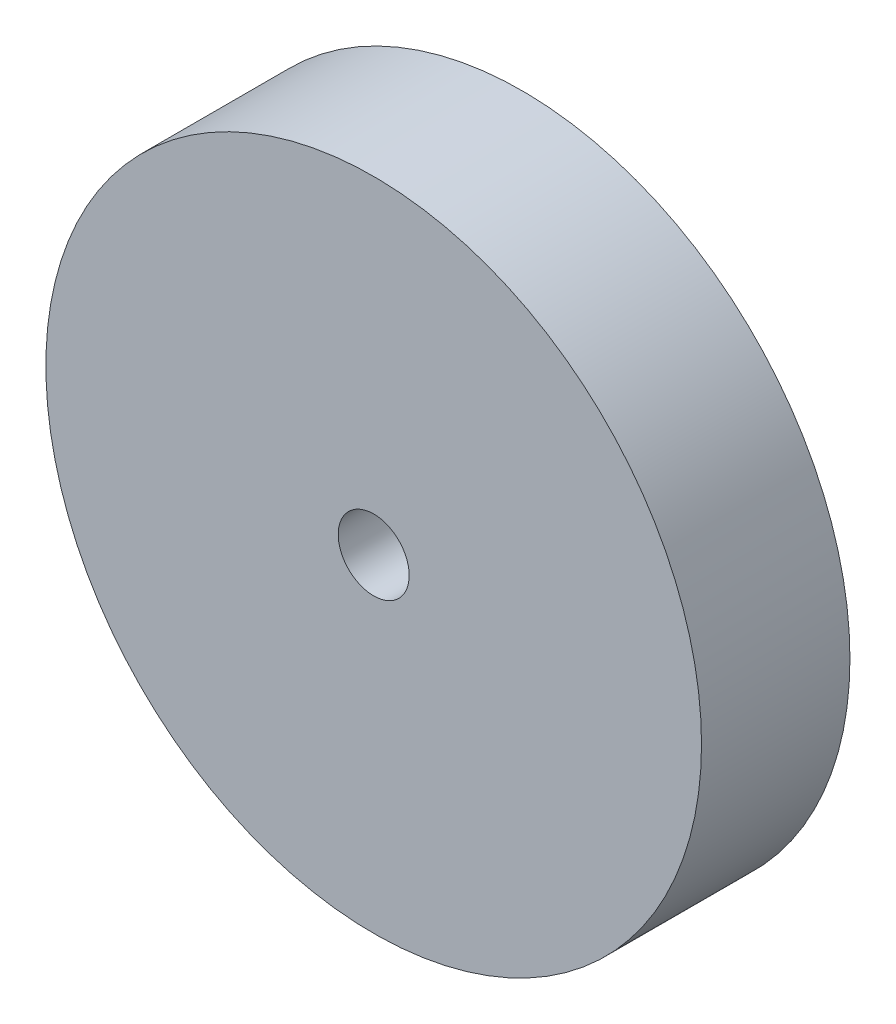
ISO-10303-21;
HEADER;
FILE_DESCRIPTION(('STEP AP214'),'2;1');
FILE_NAME('part.step','',(''),(''),'','','');
FILE_SCHEMA(('AUTOMOTIVE_DESIGN { 1 0 10303 214 1 1 1 1 }'));
ENDSEC;
DATA;
#1=APPLICATION_CONTEXT('core data for automotive mechanical design processes');
#2=APPLICATION_PROTOCOL_DEFINITION('international standard','automotive_design',2000,#1);
#3=PRODUCT_CONTEXT('',#1,'mechanical');
#4=PRODUCT('Part','Part','',(#3));
#5=PRODUCT_RELATED_PRODUCT_CATEGORY('part','',(#4));
#6=PRODUCT_DEFINITION_FORMATION('','',#4);
#7=PRODUCT_DEFINITION_CONTEXT('part definition',#1,'design');
#8=PRODUCT_DEFINITION('design','',#6,#7);
#9=PRODUCT_DEFINITION_SHAPE('','',#8);
#10=(LENGTH_UNIT() NAMED_UNIT(*) SI_UNIT(.MILLI.,.METRE.));
#11=(NAMED_UNIT(*) PLANE_ANGLE_UNIT() SI_UNIT($,.RADIAN.));
#12=(NAMED_UNIT(*) SI_UNIT($,.STERADIAN.) SOLID_ANGLE_UNIT());
#13=UNCERTAINTY_MEASURE_WITH_UNIT(LENGTH_MEASURE(1.E-05),#10,'distance_accuracy_value','');
#14=(GEOMETRIC_REPRESENTATION_CONTEXT(3) GLOBAL_UNCERTAINTY_ASSIGNED_CONTEXT((#13)) GLOBAL_UNIT_ASSIGNED_CONTEXT((#10,
#11,#12)) REPRESENTATION_CONTEXT('',''));
#15=CARTESIAN_POINT('',(0.,0.,0.));
#16=DIRECTION('',(0.,0.,1.));
#17=DIRECTION('',(1.,0.,0.));
#18=AXIS2_PLACEMENT_3D('',#15,#16,#17);
#19=CARTESIAN_POINT('',(0.,0.,11.5));
#20=DIRECTION('',(0.,0.,1.));
#21=DIRECTION('',(1.,0.,0.));
#22=AXIS2_PLACEMENT_3D('',#19,#20,#21);
#23=PLANE('',#22);
#24=CARTESIAN_POINT('',(0.,0.,11.5));
#25=DIRECTION('',(0.,0.,1.));
#26=DIRECTION('',(1.,0.,0.));
#27=AXIS2_PLACEMENT_3D('',#24,#25,#26);
#28=CIRCLE('',#27,50.8);
#29=CARTESIAN_POINT('',(50.8,0.,11.5));
#30=VERTEX_POINT('',#29);
#31=EDGE_CURVE('E10',#30,#30,#28,.T.);
#32=ORIENTED_EDGE('',*,*,#31,.T.);
#33=EDGE_LOOP('',(#32));
#34=FACE_BOUND('',#33,.T.);
#35=CARTESIAN_POINT('',(0.,0.,11.5));
#36=DIRECTION('',(0.,0.,1.));
#37=DIRECTION('',(1.,0.,0.));
#38=AXIS2_PLACEMENT_3D('',#35,#36,#37);
#39=CIRCLE('',#38,5.5);
#40=CARTESIAN_POINT('',(5.5,0.,11.5));
#41=VERTEX_POINT('',#40);
#42=EDGE_CURVE('E50',#41,#41,#39,.T.);
#43=ORIENTED_EDGE('',*,*,#42,.F.);
#44=EDGE_LOOP('',(#43));
#45=FACE_BOUND('',#44,.T.);
#46=ADVANCED_FACE('F37',(#34,#45),#23,.T.);
#47=CARTESIAN_POINT('',(0.,0.,-11.5));
#48=DIRECTION('',(0.,0.,1.));
#49=DIRECTION('',(1.,0.,0.));
#50=AXIS2_PLACEMENT_3D('',#47,#48,#49);
#51=PLANE('',#50);
#52=CARTESIAN_POINT('',(0.,0.,-11.5));
#53=DIRECTION('',(0.,0.,1.));
#54=DIRECTION('',(1.,0.,0.));
#55=AXIS2_PLACEMENT_3D('',#52,#53,#54);
#56=CIRCLE('',#55,50.8);
#57=CARTESIAN_POINT('',(50.8,0.,-11.5));
#58=VERTEX_POINT('',#57);
#59=EDGE_CURVE('E41',#58,#58,#56,.T.);
#60=ORIENTED_EDGE('',*,*,#59,.F.);
#61=EDGE_LOOP('',(#60));
#62=FACE_BOUND('',#61,.T.);
#63=CARTESIAN_POINT('',(0.,0.,-11.5));
#64=DIRECTION('',(0.,0.,1.));
#65=DIRECTION('',(1.,0.,0.));
#66=AXIS2_PLACEMENT_3D('',#63,#64,#65);
#67=CIRCLE('',#66,5.5);
#68=CARTESIAN_POINT('',(5.5,0.,-11.5));
#69=VERTEX_POINT('',#68);
#70=EDGE_CURVE('E52',#69,#69,#67,.T.);
#71=ORIENTED_EDGE('',*,*,#70,.T.);
#72=EDGE_LOOP('',(#71));
#73=FACE_BOUND('',#72,.T.);
#74=ADVANCED_FACE('F64',(#62,#73),#51,.F.);
#75=CARTESIAN_POINT('',(0.,0.,11.5));
#76=DIRECTION('',(0.,0.,-1.));
#77=DIRECTION('',(-1.,0.,0.));
#78=AXIS2_PLACEMENT_3D('',#75,#76,#77);
#79=CYLINDRICAL_SURFACE('',#78,50.8);
#80=ORIENTED_EDGE('',*,*,#31,.F.);
#81=EDGE_LOOP('',(#80));
#82=FACE_BOUND('',#81,.T.);
#83=ORIENTED_EDGE('',*,*,#59,.T.);
#84=EDGE_LOOP('',(#83));
#85=FACE_BOUND('',#84,.T.);
#86=ADVANCED_FACE('F39',(#82,#85),#79,.T.);
#87=CARTESIAN_POINT('',(0.,0.,11.5));
#88=DIRECTION('',(0.,0.,-1.));
#89=DIRECTION('',(-1.,0.,0.));
#90=AXIS2_PLACEMENT_3D('',#87,#88,#89);
#91=CYLINDRICAL_SURFACE('',#90,5.5);
#92=ORIENTED_EDGE('',*,*,#42,.T.);
#93=EDGE_LOOP('',(#92));
#94=FACE_BOUND('',#93,.T.);
#95=ORIENTED_EDGE('',*,*,#70,.F.);
#96=EDGE_LOOP('',(#95));
#97=FACE_BOUND('',#96,.T.);
#98=ADVANCED_FACE('F60',(#94,#97),#91,.F.);
#99=CLOSED_SHELL('',(#46,#74,#86,#98));
#100=MANIFOLD_SOLID_BREP('B2',#99);
#101=ADVANCED_BREP_SHAPE_REPRESENTATION('',(#18,#100),#14);
#102=SHAPE_DEFINITION_REPRESENTATION(#9,#101);
ENDSEC;
END-ISO-10303-21;
